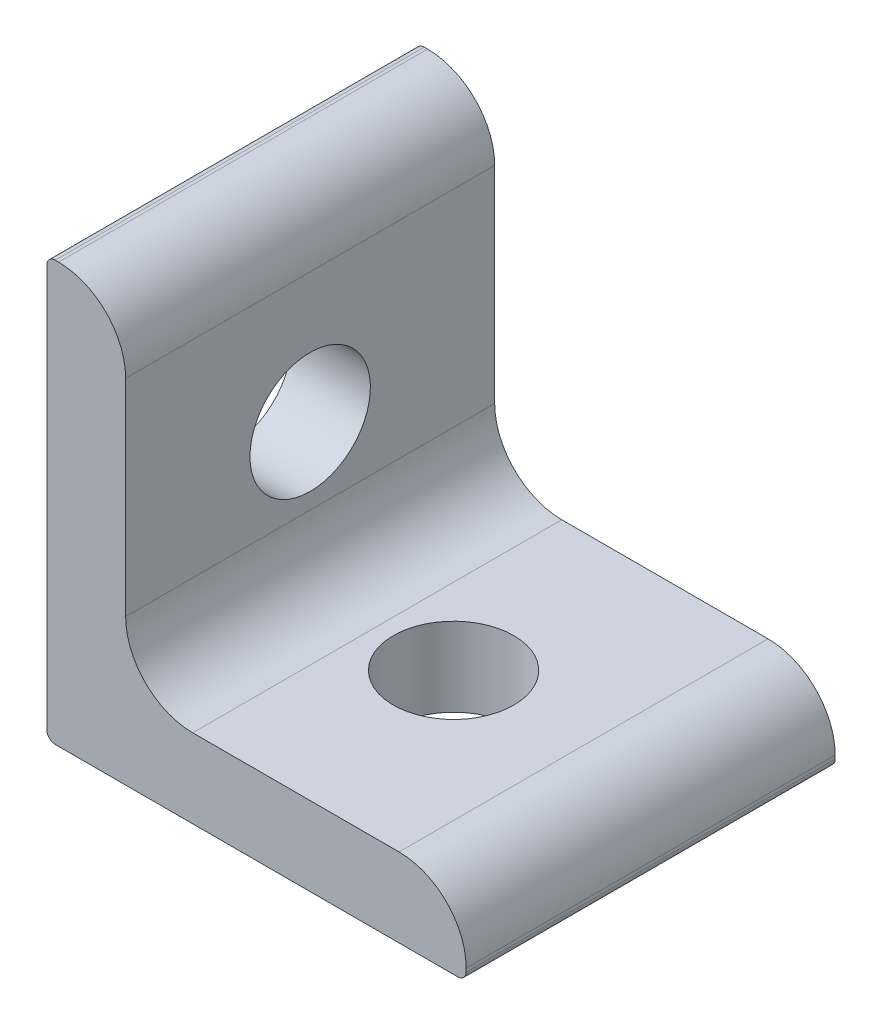
ISO-10303-21;
HEADER;
FILE_DESCRIPTION(('STEP AP214'),'2;1');
FILE_NAME('part.step','',(''),(''),'','','');
FILE_SCHEMA(('AUTOMOTIVE_DESIGN { 1 0 10303 214 1 1 1 1 }'));
ENDSEC;
DATA;
#1=APPLICATION_CONTEXT('core data for automotive mechanical design processes');
#2=APPLICATION_PROTOCOL_DEFINITION('international standard','automotive_design',2000,#1);
#3=PRODUCT_CONTEXT('',#1,'mechanical');
#4=PRODUCT('Part','Part','',(#3));
#5=PRODUCT_RELATED_PRODUCT_CATEGORY('part','',(#4));
#6=PRODUCT_DEFINITION_FORMATION('','',#4);
#7=PRODUCT_DEFINITION_CONTEXT('part definition',#1,'design');
#8=PRODUCT_DEFINITION('design','',#6,#7);
#9=PRODUCT_DEFINITION_SHAPE('','',#8);
#10=(LENGTH_UNIT() NAMED_UNIT(*) SI_UNIT(.MILLI.,.METRE.));
#11=(NAMED_UNIT(*) PLANE_ANGLE_UNIT() SI_UNIT($,.RADIAN.));
#12=(NAMED_UNIT(*) SI_UNIT($,.STERADIAN.) SOLID_ANGLE_UNIT());
#13=UNCERTAINTY_MEASURE_WITH_UNIT(LENGTH_MEASURE(1.E-05),#10,'distance_accuracy_value','');
#14=(GEOMETRIC_REPRESENTATION_CONTEXT(3) GLOBAL_UNCERTAINTY_ASSIGNED_CONTEXT((#13)) GLOBAL_UNIT_ASSIGNED_CONTEXT((#10,
#11,#12)) REPRESENTATION_CONTEXT('',''));
#15=CARTESIAN_POINT('',(0.,0.,0.));
#16=DIRECTION('',(0.,0.,1.));
#17=DIRECTION('',(1.,0.,0.));
#18=AXIS2_PLACEMENT_3D('',#15,#16,#17);
#19=CARTESIAN_POINT('',(0.,25.,22.));
#20=DIRECTION('',(1.,0.,0.));
#21=DIRECTION('',(0.,1.,0.));
#22=AXIS2_PLACEMENT_3D('',#19,#20,#21);
#23=PLANE('',#22);
#24=CARTESIAN_POINT('',(0.,13.25,11.));
#25=DIRECTION('',(-1.,0.,0.));
#26=DIRECTION('',(0.,-1.,0.));
#27=AXIS2_PLACEMENT_3D('',#24,#25,#26);
#28=CIRCLE('',#27,3.59);
#29=CARTESIAN_POINT('',(0.,9.66,11.));
#30=VERTEX_POINT('',#29);
#31=EDGE_CURVE('E168',#30,#30,#28,.T.);
#32=ORIENTED_EDGE('',*,*,#31,.F.);
#33=EDGE_LOOP('',(#32));
#34=FACE_BOUND('',#33,.T.);
#35=DIRECTION('',(0.,-1.,0.));
#36=VECTOR('',#35,1.);
#37=CARTESIAN_POINT('',(0.,25.,0.));
#38=LINE('',#37,#36);
#39=CARTESIAN_POINT('',(0.,24.5,0.));
#40=VERTEX_POINT('',#39);
#41=CARTESIAN_POINT('',(0.,0.5,0.));
#42=VERTEX_POINT('',#41);
#43=EDGE_CURVE('E163',#40,#42,#38,.T.);
#44=ORIENTED_EDGE('',*,*,#43,.T.);
#45=DIRECTION('',(0.,0.,-1.));
#46=VECTOR('',#45,1.);
#47=CARTESIAN_POINT('',(0.,0.5,22.));
#48=LINE('',#47,#46);
#49=CARTESIAN_POINT('',(0.,0.5,22.));
#50=VERTEX_POINT('',#49);
#51=EDGE_CURVE('E40',#42,#50,#48,.F.);
#52=ORIENTED_EDGE('',*,*,#51,.T.);
#53=DIRECTION('',(0.,-1.,0.));
#54=VECTOR('',#53,1.);
#55=CARTESIAN_POINT('',(0.,25.,22.));
#56=LINE('',#55,#54);
#57=CARTESIAN_POINT('',(0.,24.5,22.));
#58=VERTEX_POINT('',#57);
#59=EDGE_CURVE('E159',#58,#50,#56,.T.);
#60=ORIENTED_EDGE('',*,*,#59,.F.);
#61=DIRECTION('',(0.,0.,-1.));
#62=VECTOR('',#61,1.);
#63=CARTESIAN_POINT('',(0.,24.5,22.));
#64=LINE('',#63,#62);
#65=EDGE_CURVE('E207',#58,#40,#64,.T.);
#66=ORIENTED_EDGE('',*,*,#65,.T.);
#67=EDGE_LOOP('',(#44,#52,#60,#66));
#68=FACE_BOUND('',#67,.T.);
#69=ADVANCED_FACE('F32',(#34,#68),#23,.F.);
#70=CARTESIAN_POINT('',(0.,0.,22.));
#71=DIRECTION('',(0.,1.,0.));
#72=DIRECTION('',(0.,0.,1.));
#73=AXIS2_PLACEMENT_3D('',#70,#71,#72);
#74=PLANE('',#73);
#75=CARTESIAN_POINT('',(13.25,0.,11.));
#76=DIRECTION('',(0.,-1.,0.));
#77=DIRECTION('',(0.,0.,-1.));
#78=AXIS2_PLACEMENT_3D('',#75,#76,#77);
#79=CIRCLE('',#78,3.59);
#80=CARTESIAN_POINT('',(13.25,0.,7.41));
#81=VERTEX_POINT('',#80);
#82=EDGE_CURVE('E164',#81,#81,#79,.T.);
#83=ORIENTED_EDGE('',*,*,#82,.F.);
#84=EDGE_LOOP('',(#83));
#85=FACE_BOUND('',#84,.T.);
#86=DIRECTION('',(1.,0.,0.));
#87=VECTOR('',#86,1.);
#88=CARTESIAN_POINT('',(0.,0.,0.));
#89=LINE('',#88,#87);
#90=CARTESIAN_POINT('',(0.5,0.,0.));
#91=VERTEX_POINT('',#90);
#92=CARTESIAN_POINT('',(24.5,0.,0.));
#93=VERTEX_POINT('',#92);
#94=EDGE_CURVE('E153',#91,#93,#89,.T.);
#95=ORIENTED_EDGE('',*,*,#94,.T.);
#96=DIRECTION('',(0.,0.,-1.));
#97=VECTOR('',#96,1.);
#98=CARTESIAN_POINT('',(24.5,0.,22.));
#99=LINE('',#98,#97);
#100=CARTESIAN_POINT('',(24.5,0.,22.));
#101=VERTEX_POINT('',#100);
#102=EDGE_CURVE('E200',#93,#101,#99,.F.);
#103=ORIENTED_EDGE('',*,*,#102,.T.);
#104=DIRECTION('',(1.,0.,0.));
#105=VECTOR('',#104,1.);
#106=CARTESIAN_POINT('',(0.,0.,22.));
#107=LINE('',#106,#105);
#108=CARTESIAN_POINT('',(0.5,0.,22.));
#109=VERTEX_POINT('',#108);
#110=EDGE_CURVE('E224',#109,#101,#107,.T.);
#111=ORIENTED_EDGE('',*,*,#110,.F.);
#112=DIRECTION('',(0.,0.,-1.));
#113=VECTOR('',#112,1.);
#114=CARTESIAN_POINT('',(0.5,0.,22.));
#115=LINE('',#114,#113);
#116=EDGE_CURVE('E197',#109,#91,#115,.T.);
#117=ORIENTED_EDGE('',*,*,#116,.T.);
#118=EDGE_LOOP('',(#95,#103,#111,#117));
#119=FACE_BOUND('',#118,.T.);
#120=ADVANCED_FACE('F237',(#85,#119),#74,.F.);
#121=CARTESIAN_POINT('',(25.,0.,22.));
#122=DIRECTION('',(-1.,0.,0.));
#123=DIRECTION('',(0.,0.,1.));
#124=AXIS2_PLACEMENT_3D('',#121,#122,#123);
#125=PLANE('',#124);
#126=DIRECTION('',(0.,1.,0.));
#127=VECTOR('',#126,1.);
#128=CARTESIAN_POINT('',(25.,0.,22.));
#129=LINE('',#128,#127);
#130=CARTESIAN_POINT('',(25.,0.5,22.));
#131=VERTEX_POINT('',#130);
#132=CARTESIAN_POINT('',(25.,0.700000000000002,22.));
#133=VERTEX_POINT('',#132);
#134=EDGE_CURVE('E222',#131,#133,#129,.T.);
#135=ORIENTED_EDGE('',*,*,#134,.F.);
#136=DIRECTION('',(0.,0.,-1.));
#137=VECTOR('',#136,1.);
#138=CARTESIAN_POINT('',(25.,0.5,22.));
#139=LINE('',#138,#137);
#140=CARTESIAN_POINT('',(25.,0.5,0.));
#141=VERTEX_POINT('',#140);
#142=EDGE_CURVE('E188',#131,#141,#139,.T.);
#143=ORIENTED_EDGE('',*,*,#142,.T.);
#144=DIRECTION('',(0.,1.,0.));
#145=VECTOR('',#144,1.);
#146=CARTESIAN_POINT('',(25.,0.,0.));
#147=LINE('',#146,#145);
#148=CARTESIAN_POINT('',(25.,0.700000000000002,0.));
#149=VERTEX_POINT('',#148);
#150=EDGE_CURVE('E148',#141,#149,#147,.T.);
#151=ORIENTED_EDGE('',*,*,#150,.T.);
#152=DIRECTION('',(0.,0.,-1.));
#153=VECTOR('',#152,1.);
#154=CARTESIAN_POINT('',(25.,0.700000000000002,22.));
#155=LINE('',#154,#153);
#156=EDGE_CURVE('E128',#149,#133,#155,.F.);
#157=ORIENTED_EDGE('',*,*,#156,.T.);
#158=EDGE_LOOP('',(#135,#143,#151,#157));
#159=FACE_BOUND('',#158,.T.);
#160=ADVANCED_FACE('F242',(#159),#125,.F.);
#161=CARTESIAN_POINT('',(25.,4.7,22.));
#162=DIRECTION('',(0.,-1.,0.));
#163=DIRECTION('',(1.,0.,0.));
#164=AXIS2_PLACEMENT_3D('',#161,#162,#163);
#165=PLANE('',#164);
#166=CARTESIAN_POINT('',(13.25,4.7,11.));
#167=DIRECTION('',(0.,-1.,0.));
#168=DIRECTION('',(1.,0.,0.));
#169=AXIS2_PLACEMENT_3D('',#166,#167,#168);
#170=CIRCLE('',#169,3.59);
#171=CARTESIAN_POINT('',(16.84,4.7,11.));
#172=VERTEX_POINT('',#171);
#173=EDGE_CURVE('E160',#172,#172,#170,.T.);
#174=ORIENTED_EDGE('',*,*,#173,.T.);
#175=EDGE_LOOP('',(#174));
#176=FACE_BOUND('',#175,.T.);
#177=DIRECTION('',(-1.,0.,0.));
#178=VECTOR('',#177,1.);
#179=CARTESIAN_POINT('',(25.,4.7,22.));
#180=LINE('',#179,#178);
#181=CARTESIAN_POINT('',(21.,4.7,22.));
#182=VERTEX_POINT('',#181);
#183=CARTESIAN_POINT('',(8.7,4.7,22.));
#184=VERTEX_POINT('',#183);
#185=EDGE_CURVE('E141',#182,#184,#180,.T.);
#186=ORIENTED_EDGE('',*,*,#185,.F.);
#187=DIRECTION('',(0.,0.,-1.));
#188=VECTOR('',#187,1.);
#189=CARTESIAN_POINT('',(21.,4.7,22.));
#190=LINE('',#189,#188);
#191=CARTESIAN_POINT('',(21.,4.7,0.));
#192=VERTEX_POINT('',#191);
#193=EDGE_CURVE('E126',#182,#192,#190,.T.);
#194=ORIENTED_EDGE('',*,*,#193,.T.);
#195=DIRECTION('',(-1.,0.,0.));
#196=VECTOR('',#195,1.);
#197=CARTESIAN_POINT('',(25.,4.7,0.));
#198=LINE('',#197,#196);
#199=CARTESIAN_POINT('',(8.7,4.7,0.));
#200=VERTEX_POINT('',#199);
#201=EDGE_CURVE('E138',#192,#200,#198,.T.);
#202=ORIENTED_EDGE('',*,*,#201,.T.);
#203=DIRECTION('',(0.,0.,-1.));
#204=VECTOR('',#203,1.);
#205=CARTESIAN_POINT('',(8.7,4.7,22.));
#206=LINE('',#205,#204);
#207=EDGE_CURVE('E142',#200,#184,#206,.F.);
#208=ORIENTED_EDGE('',*,*,#207,.T.);
#209=EDGE_LOOP('',(#186,#194,#202,#208));
#210=FACE_BOUND('',#209,.T.);
#211=ADVANCED_FACE('F137',(#176,#210),#165,.F.);
#212=CARTESIAN_POINT('',(4.7,4.7,22.));
#213=DIRECTION('',(-1.,0.,0.));
#214=DIRECTION('',(0.,0.,1.));
#215=AXIS2_PLACEMENT_3D('',#212,#213,#214);
#216=PLANE('',#215);
#217=CARTESIAN_POINT('',(4.7,13.25,11.));
#218=DIRECTION('',(-1.,0.,0.));
#219=DIRECTION('',(0.,0.,1.));
#220=AXIS2_PLACEMENT_3D('',#217,#218,#219);
#221=CIRCLE('',#220,3.59);
#222=CARTESIAN_POINT('',(4.7,13.25,14.59));
#223=VERTEX_POINT('',#222);
#224=EDGE_CURVE('E165',#223,#223,#221,.T.);
#225=ORIENTED_EDGE('',*,*,#224,.T.);
#226=EDGE_LOOP('',(#225));
#227=FACE_BOUND('',#226,.T.);
#228=DIRECTION('',(0.,1.,0.));
#229=VECTOR('',#228,1.);
#230=CARTESIAN_POINT('',(4.7,4.7,22.));
#231=LINE('',#230,#229);
#232=CARTESIAN_POINT('',(4.7,8.7,22.));
#233=VERTEX_POINT('',#232);
#234=CARTESIAN_POINT('',(4.7,21.,22.));
#235=VERTEX_POINT('',#234);
#236=EDGE_CURVE('E218',#233,#235,#231,.T.);
#237=ORIENTED_EDGE('',*,*,#236,.F.);
#238=DIRECTION('',(0.,0.,-1.));
#239=VECTOR('',#238,1.);
#240=CARTESIAN_POINT('',(4.7,8.7,0.));
#241=LINE('',#240,#239);
#242=CARTESIAN_POINT('',(4.7,8.7,0.));
#243=VERTEX_POINT('',#242);
#244=EDGE_CURVE('E179',#233,#243,#241,.T.);
#245=ORIENTED_EDGE('',*,*,#244,.T.);
#246=DIRECTION('',(0.,1.,0.));
#247=VECTOR('',#246,1.);
#248=CARTESIAN_POINT('',(4.7,4.7,0.));
#249=LINE('',#248,#247);
#250=CARTESIAN_POINT('',(4.7,21.,0.));
#251=VERTEX_POINT('',#250);
#252=EDGE_CURVE('E147',#243,#251,#249,.T.);
#253=ORIENTED_EDGE('',*,*,#252,.T.);
#254=DIRECTION('',(0.,0.,-1.));
#255=VECTOR('',#254,1.);
#256=CARTESIAN_POINT('',(4.7,21.,22.));
#257=LINE('',#256,#255);
#258=EDGE_CURVE('E177',#251,#235,#257,.F.);
#259=ORIENTED_EDGE('',*,*,#258,.T.);
#260=EDGE_LOOP('',(#237,#245,#253,#259));
#261=FACE_BOUND('',#260,.T.);
#262=ADVANCED_FACE('F280',(#227,#261),#216,.F.);
#263=CARTESIAN_POINT('',(4.7,25.,22.));
#264=DIRECTION('',(0.,-1.,0.));
#265=DIRECTION('',(0.,0.,-1.));
#266=AXIS2_PLACEMENT_3D('',#263,#264,#265);
#267=PLANE('',#266);
#268=DIRECTION('',(-1.,0.,0.));
#269=VECTOR('',#268,1.);
#270=CARTESIAN_POINT('',(4.7,25.,0.));
#271=LINE('',#270,#269);
#272=CARTESIAN_POINT('',(0.700000000000003,25.,0.));
#273=VERTEX_POINT('',#272);
#274=CARTESIAN_POINT('',(0.5,25.,0.));
#275=VERTEX_POINT('',#274);
#276=EDGE_CURVE('E151',#273,#275,#271,.T.);
#277=ORIENTED_EDGE('',*,*,#276,.T.);
#278=DIRECTION('',(0.,0.,-1.));
#279=VECTOR('',#278,1.);
#280=CARTESIAN_POINT('',(0.5,25.,22.));
#281=LINE('',#280,#279);
#282=CARTESIAN_POINT('',(0.5,25.,22.));
#283=VERTEX_POINT('',#282);
#284=EDGE_CURVE('E11',#275,#283,#281,.F.);
#285=ORIENTED_EDGE('',*,*,#284,.T.);
#286=DIRECTION('',(-1.,0.,0.));
#287=VECTOR('',#286,1.);
#288=CARTESIAN_POINT('',(4.7,25.,22.));
#289=LINE('',#288,#287);
#290=CARTESIAN_POINT('',(0.700000000000003,25.,22.));
#291=VERTEX_POINT('',#290);
#292=EDGE_CURVE('E169',#291,#283,#289,.T.);
#293=ORIENTED_EDGE('',*,*,#292,.F.);
#294=DIRECTION('',(0.,0.,-1.));
#295=VECTOR('',#294,1.);
#296=CARTESIAN_POINT('',(0.700000000000003,25.,22.));
#297=LINE('',#296,#295);
#298=EDGE_CURVE('E182',#291,#273,#297,.T.);
#299=ORIENTED_EDGE('',*,*,#298,.T.);
#300=EDGE_LOOP('',(#277,#285,#293,#299));
#301=FACE_BOUND('',#300,.T.);
#302=ADVANCED_FACE('F286',(#301),#267,.F.);
#303=CARTESIAN_POINT('',(0.,0.,22.));
#304=DIRECTION('',(0.,0.,1.));
#305=DIRECTION('',(1.,0.,0.));
#306=AXIS2_PLACEMENT_3D('',#303,#304,#305);
#307=PLANE('',#306);
#308=ORIENTED_EDGE('',*,*,#110,.T.);
#309=CARTESIAN_POINT('',(24.5,0.5,22.));
#310=DIRECTION('',(0.,0.,1.));
#311=DIRECTION('',(1.,0.,0.));
#312=AXIS2_PLACEMENT_3D('',#309,#310,#311);
#313=CIRCLE('',#312,0.5);
#314=EDGE_CURVE('E205',#101,#131,#313,.T.);
#315=ORIENTED_EDGE('',*,*,#314,.T.);
#316=ORIENTED_EDGE('',*,*,#134,.T.);
#317=CARTESIAN_POINT('',(21.,0.700000000000002,22.));
#318=DIRECTION('',(0.,0.,1.));
#319=DIRECTION('',(1.,0.,0.));
#320=AXIS2_PLACEMENT_3D('',#317,#318,#319);
#321=CIRCLE('',#320,4.);
#322=EDGE_CURVE('E175',#133,#182,#321,.T.);
#323=ORIENTED_EDGE('',*,*,#322,.T.);
#324=ORIENTED_EDGE('',*,*,#185,.T.);
#325=CARTESIAN_POINT('',(8.7,8.7,22.));
#326=DIRECTION('',(0.,0.,1.));
#327=DIRECTION('',(1.,0.,0.));
#328=AXIS2_PLACEMENT_3D('',#325,#326,#327);
#329=CIRCLE('',#328,4.);
#330=EDGE_CURVE('E186',#184,#233,#329,.F.);
#331=ORIENTED_EDGE('',*,*,#330,.T.);
#332=ORIENTED_EDGE('',*,*,#236,.T.);
#333=CARTESIAN_POINT('',(0.700000000000003,21.,22.));
#334=DIRECTION('',(0.,0.,1.));
#335=DIRECTION('',(1.,0.,0.));
#336=AXIS2_PLACEMENT_3D('',#333,#334,#335);
#337=CIRCLE('',#336,4.);
#338=EDGE_CURVE('E173',#235,#291,#337,.T.);
#339=ORIENTED_EDGE('',*,*,#338,.T.);
#340=ORIENTED_EDGE('',*,*,#292,.T.);
#341=CARTESIAN_POINT('',(0.5,24.5,22.));
#342=DIRECTION('',(0.,0.,1.));
#343=DIRECTION('',(1.,0.,0.));
#344=AXIS2_PLACEMENT_3D('',#341,#342,#343);
#345=CIRCLE('',#344,0.5);
#346=EDGE_CURVE('E53',#283,#58,#345,.T.);
#347=ORIENTED_EDGE('',*,*,#346,.T.);
#348=ORIENTED_EDGE('',*,*,#59,.T.);
#349=CARTESIAN_POINT('',(0.5,0.5,22.));
#350=DIRECTION('',(0.,0.,1.));
#351=DIRECTION('',(1.,0.,0.));
#352=AXIS2_PLACEMENT_3D('',#349,#350,#351);
#353=CIRCLE('',#352,0.5);
#354=EDGE_CURVE('E203',#50,#109,#353,.T.);
#355=ORIENTED_EDGE('',*,*,#354,.T.);
#356=EDGE_LOOP('',(#308,#315,#316,#323,#324,#331,#332,#339,#340,#347,#348,#355));
#357=FACE_BOUND('',#356,.T.);
#358=ADVANCED_FACE('F269',(#357),#307,.T.);
#359=CARTESIAN_POINT('',(0.,0.,0.));
#360=DIRECTION('',(0.,0.,1.));
#361=DIRECTION('',(1.,0.,0.));
#362=AXIS2_PLACEMENT_3D('',#359,#360,#361);
#363=PLANE('',#362);
#364=ORIENTED_EDGE('',*,*,#150,.F.);
#365=CARTESIAN_POINT('',(24.5,0.5,0.));
#366=DIRECTION('',(0.,0.,1.));
#367=DIRECTION('',(1.,0.,0.));
#368=AXIS2_PLACEMENT_3D('',#365,#366,#367);
#369=CIRCLE('',#368,0.5);
#370=EDGE_CURVE('E195',#141,#93,#369,.F.);
#371=ORIENTED_EDGE('',*,*,#370,.T.);
#372=ORIENTED_EDGE('',*,*,#94,.F.);
#373=CARTESIAN_POINT('',(0.5,0.5,0.));
#374=DIRECTION('',(0.,0.,1.));
#375=DIRECTION('',(1.,0.,0.));
#376=AXIS2_PLACEMENT_3D('',#373,#374,#375);
#377=CIRCLE('',#376,0.5);
#378=EDGE_CURVE('E193',#91,#42,#377,.F.);
#379=ORIENTED_EDGE('',*,*,#378,.T.);
#380=ORIENTED_EDGE('',*,*,#43,.F.);
#381=CARTESIAN_POINT('',(0.5,24.5,0.));
#382=DIRECTION('',(0.,0.,1.));
#383=DIRECTION('',(1.,0.,0.));
#384=AXIS2_PLACEMENT_3D('',#381,#382,#383);
#385=CIRCLE('',#384,0.5);
#386=EDGE_CURVE('E191',#40,#275,#385,.F.);
#387=ORIENTED_EDGE('',*,*,#386,.T.);
#388=ORIENTED_EDGE('',*,*,#276,.F.);
#389=CARTESIAN_POINT('',(0.700000000000003,21.,0.));
#390=DIRECTION('',(0.,0.,1.));
#391=DIRECTION('',(1.,0.,0.));
#392=AXIS2_PLACEMENT_3D('',#389,#390,#391);
#393=CIRCLE('',#392,4.);
#394=EDGE_CURVE('E132',#273,#251,#393,.F.);
#395=ORIENTED_EDGE('',*,*,#394,.T.);
#396=ORIENTED_EDGE('',*,*,#252,.F.);
#397=CARTESIAN_POINT('',(8.7,8.7,0.));
#398=DIRECTION('',(0.,0.,1.));
#399=DIRECTION('',(1.,0.,0.));
#400=AXIS2_PLACEMENT_3D('',#397,#398,#399);
#401=CIRCLE('',#400,4.);
#402=EDGE_CURVE('E146',#243,#200,#401,.T.);
#403=ORIENTED_EDGE('',*,*,#402,.T.);
#404=ORIENTED_EDGE('',*,*,#201,.F.);
#405=CARTESIAN_POINT('',(21.,0.700000000000002,0.));
#406=DIRECTION('',(0.,0.,1.));
#407=DIRECTION('',(1.,0.,0.));
#408=AXIS2_PLACEMENT_3D('',#405,#406,#407);
#409=CIRCLE('',#408,4.);
#410=EDGE_CURVE('E122',#192,#149,#409,.F.);
#411=ORIENTED_EDGE('',*,*,#410,.T.);
#412=EDGE_LOOP('',(#364,#371,#372,#379,#380,#387,#388,#395,#396,#403,#404,#411));
#413=FACE_BOUND('',#412,.T.);
#414=ADVANCED_FACE('F144',(#413),#363,.F.);
#415=CARTESIAN_POINT('',(13.25,25.,11.));
#416=DIRECTION('',(0.,-1.,0.));
#417=DIRECTION('',(0.,0.,-1.));
#418=AXIS2_PLACEMENT_3D('',#415,#416,#417);
#419=CYLINDRICAL_SURFACE('',#418,3.59);
#420=ORIENTED_EDGE('',*,*,#82,.T.);
#421=EDGE_LOOP('',(#420));
#422=FACE_BOUND('',#421,.T.);
#423=ORIENTED_EDGE('',*,*,#173,.F.);
#424=EDGE_LOOP('',(#423));
#425=FACE_BOUND('',#424,.T.);
#426=ADVANCED_FACE('F373',(#422,#425),#419,.F.);
#427=CARTESIAN_POINT('',(25.,13.25,11.));
#428=DIRECTION('',(-1.,0.,0.));
#429=DIRECTION('',(0.,-1.,0.));
#430=AXIS2_PLACEMENT_3D('',#427,#428,#429);
#431=CYLINDRICAL_SURFACE('',#430,3.59);
#432=ORIENTED_EDGE('',*,*,#31,.T.);
#433=EDGE_LOOP('',(#432));
#434=FACE_BOUND('',#433,.T.);
#435=ORIENTED_EDGE('',*,*,#224,.F.);
#436=EDGE_LOOP('',(#435));
#437=FACE_BOUND('',#436,.T.);
#438=ADVANCED_FACE('F233',(#434,#437),#431,.F.);
#439=CARTESIAN_POINT('',(21.,0.700000000000002,22.));
#440=DIRECTION('',(0.,0.,-1.));
#441=DIRECTION('',(-1.,0.,0.));
#442=AXIS2_PLACEMENT_3D('',#439,#440,#441);
#443=CYLINDRICAL_SURFACE('',#442,4.);
#444=ORIENTED_EDGE('',*,*,#322,.F.);
#445=ORIENTED_EDGE('',*,*,#156,.F.);
#446=ORIENTED_EDGE('',*,*,#410,.F.);
#447=ORIENTED_EDGE('',*,*,#193,.F.);
#448=EDGE_LOOP('',(#444,#445,#446,#447));
#449=FACE_BOUND('',#448,.T.);
#450=ADVANCED_FACE('F125',(#449),#443,.T.);
#451=CARTESIAN_POINT('',(8.7,8.7,22.));
#452=DIRECTION('',(0.,0.,1.));
#453=DIRECTION('',(1.,0.,0.));
#454=AXIS2_PLACEMENT_3D('',#451,#452,#453);
#455=CYLINDRICAL_SURFACE('',#454,4.);
#456=ORIENTED_EDGE('',*,*,#330,.F.);
#457=ORIENTED_EDGE('',*,*,#207,.F.);
#458=ORIENTED_EDGE('',*,*,#402,.F.);
#459=ORIENTED_EDGE('',*,*,#244,.F.);
#460=EDGE_LOOP('',(#456,#457,#458,#459));
#461=FACE_BOUND('',#460,.T.);
#462=ADVANCED_FACE('F249',(#461),#455,.F.);
#463=CARTESIAN_POINT('',(0.700000000000003,21.,22.));
#464=DIRECTION('',(0.,0.,-1.));
#465=DIRECTION('',(-1.,0.,0.));
#466=AXIS2_PLACEMENT_3D('',#463,#464,#465);
#467=CYLINDRICAL_SURFACE('',#466,4.);
#468=ORIENTED_EDGE('',*,*,#338,.F.);
#469=ORIENTED_EDGE('',*,*,#258,.F.);
#470=ORIENTED_EDGE('',*,*,#394,.F.);
#471=ORIENTED_EDGE('',*,*,#298,.F.);
#472=EDGE_LOOP('',(#468,#469,#470,#471));
#473=FACE_BOUND('',#472,.T.);
#474=ADVANCED_FACE('F252',(#473),#467,.T.);
#475=CARTESIAN_POINT('',(24.5,0.5,22.));
#476=DIRECTION('',(0.,0.,-1.));
#477=DIRECTION('',(-1.,0.,0.));
#478=AXIS2_PLACEMENT_3D('',#475,#476,#477);
#479=CYLINDRICAL_SURFACE('',#478,0.5);
#480=ORIENTED_EDGE('',*,*,#314,.F.);
#481=ORIENTED_EDGE('',*,*,#102,.F.);
#482=ORIENTED_EDGE('',*,*,#370,.F.);
#483=ORIENTED_EDGE('',*,*,#142,.F.);
#484=EDGE_LOOP('',(#480,#481,#482,#483));
#485=FACE_BOUND('',#484,.T.);
#486=ADVANCED_FACE('F256',(#485),#479,.T.);
#487=CARTESIAN_POINT('',(0.5,0.5,22.));
#488=DIRECTION('',(0.,0.,-1.));
#489=DIRECTION('',(-1.,0.,0.));
#490=AXIS2_PLACEMENT_3D('',#487,#488,#489);
#491=CYLINDRICAL_SURFACE('',#490,0.5);
#492=ORIENTED_EDGE('',*,*,#354,.F.);
#493=ORIENTED_EDGE('',*,*,#51,.F.);
#494=ORIENTED_EDGE('',*,*,#378,.F.);
#495=ORIENTED_EDGE('',*,*,#116,.F.);
#496=EDGE_LOOP('',(#492,#493,#494,#495));
#497=FACE_BOUND('',#496,.T.);
#498=ADVANCED_FACE('F259',(#497),#491,.T.);
#499=CARTESIAN_POINT('',(0.5,24.5,22.));
#500=DIRECTION('',(0.,0.,-1.));
#501=DIRECTION('',(-1.,0.,0.));
#502=AXIS2_PLACEMENT_3D('',#499,#500,#501);
#503=CYLINDRICAL_SURFACE('',#502,0.5);
#504=ORIENTED_EDGE('',*,*,#346,.F.);
#505=ORIENTED_EDGE('',*,*,#284,.F.);
#506=ORIENTED_EDGE('',*,*,#386,.F.);
#507=ORIENTED_EDGE('',*,*,#65,.F.);
#508=EDGE_LOOP('',(#504,#505,#506,#507));
#509=FACE_BOUND('',#508,.T.);
#510=ADVANCED_FACE('F34',(#509),#503,.T.);
#511=CLOSED_SHELL('',(#69,#120,#160,#211,#262,#302,#358,#414,#426,#438,#450,#462,#474,#486,#498,#510));
#512=MANIFOLD_SOLID_BREP('B2',#511);
#513=ADVANCED_BREP_SHAPE_REPRESENTATION('',(#18,#512),#14);
#514=SHAPE_DEFINITION_REPRESENTATION(#9,#513);
ENDSEC;
END-ISO-10303-21;
